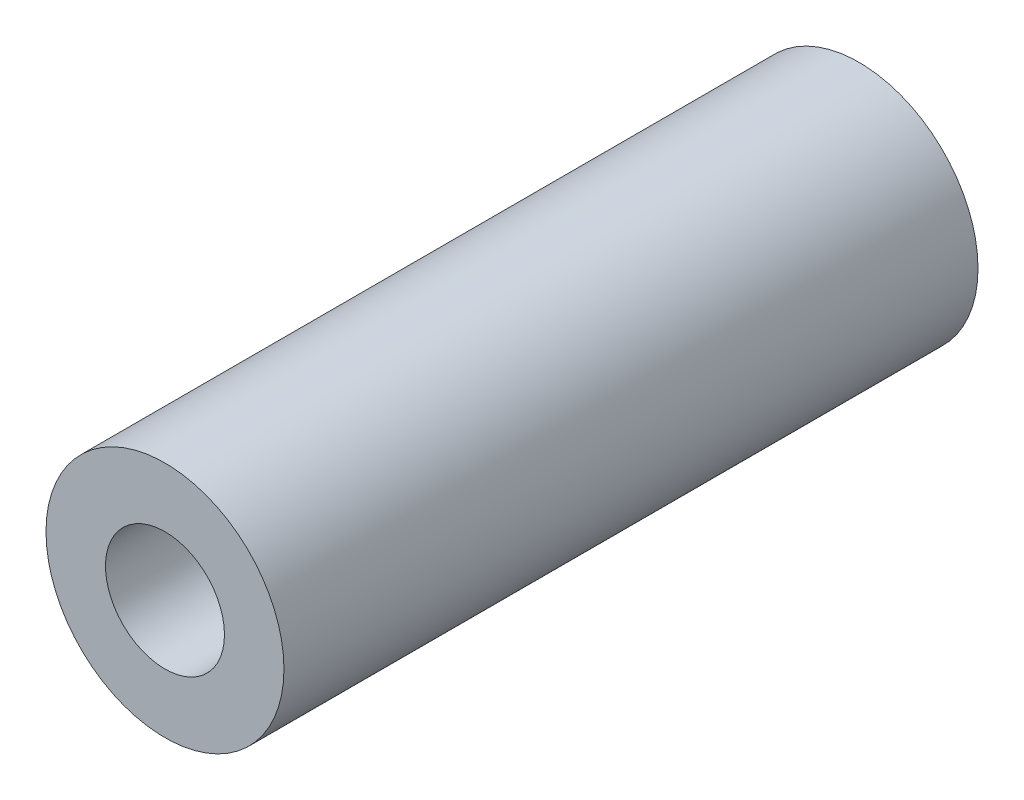
ISO-10303-21;
HEADER;
FILE_DESCRIPTION(('STEP AP214'),'2;1');
FILE_NAME('part.step','',(''),(''),'','','');
FILE_SCHEMA(('AUTOMOTIVE_DESIGN { 1 0 10303 214 1 1 1 1 }'));
ENDSEC;
DATA;
#1=APPLICATION_CONTEXT('core data for automotive mechanical design processes');
#2=APPLICATION_PROTOCOL_DEFINITION('international standard','automotive_design',2000,#1);
#3=PRODUCT_CONTEXT('',#1,'mechanical');
#4=PRODUCT('Part','Part','',(#3));
#5=PRODUCT_RELATED_PRODUCT_CATEGORY('part','',(#4));
#6=PRODUCT_DEFINITION_FORMATION('','',#4);
#7=PRODUCT_DEFINITION_CONTEXT('part definition',#1,'design');
#8=PRODUCT_DEFINITION('design','',#6,#7);
#9=PRODUCT_DEFINITION_SHAPE('','',#8);
#10=(LENGTH_UNIT() NAMED_UNIT(*) SI_UNIT(.MILLI.,.METRE.));
#11=(NAMED_UNIT(*) PLANE_ANGLE_UNIT() SI_UNIT($,.RADIAN.));
#12=(NAMED_UNIT(*) SI_UNIT($,.STERADIAN.) SOLID_ANGLE_UNIT());
#13=UNCERTAINTY_MEASURE_WITH_UNIT(LENGTH_MEASURE(1.E-05),#10,'distance_accuracy_value','');
#14=(GEOMETRIC_REPRESENTATION_CONTEXT(3) GLOBAL_UNCERTAINTY_ASSIGNED_CONTEXT((#13)) GLOBAL_UNIT_ASSIGNED_CONTEXT((#10,
#11,#12)) REPRESENTATION_CONTEXT('',''));
#15=CARTESIAN_POINT('',(0.,0.,0.));
#16=DIRECTION('',(0.,0.,1.));
#17=DIRECTION('',(1.,0.,0.));
#18=AXIS2_PLACEMENT_3D('',#15,#16,#17);
#19=CARTESIAN_POINT('',(0.,0.,35.));
#20=DIRECTION('',(0.,0.,-1.));
#21=DIRECTION('',(-1.,0.,0.));
#22=AXIS2_PLACEMENT_3D('',#19,#20,#21);
#23=CYLINDRICAL_SURFACE('',#22,3.);
#24=CARTESIAN_POINT('',(0.,0.,5.));
#25=DIRECTION('',(0.,0.,1.));
#26=DIRECTION('',(1.,0.,0.));
#27=AXIS2_PLACEMENT_3D('',#24,#25,#26);
#28=CIRCLE('',#27,3.);
#29=CARTESIAN_POINT('',(3.,0.,5.));
#30=VERTEX_POINT('',#29);
#31=EDGE_CURVE('E10',#30,#30,#28,.T.);
#32=ORIENTED_EDGE('',*,*,#31,.F.);
#33=EDGE_LOOP('',(#32));
#34=FACE_BOUND('',#33,.T.);
#35=CARTESIAN_POINT('',(0.,0.,35.));
#36=DIRECTION('',(0.,0.,1.));
#37=DIRECTION('',(1.,0.,0.));
#38=AXIS2_PLACEMENT_3D('',#35,#36,#37);
#39=CIRCLE('',#38,3.);
#40=CARTESIAN_POINT('',(3.,0.,35.));
#41=VERTEX_POINT('',#40);
#42=EDGE_CURVE('E49',#41,#41,#39,.T.);
#43=ORIENTED_EDGE('',*,*,#42,.T.);
#44=EDGE_LOOP('',(#43));
#45=FACE_BOUND('',#44,.T.);
#46=ADVANCED_FACE('F37',(#34,#45),#23,.F.);
#47=CARTESIAN_POINT('',(0.,0.,35.));
#48=DIRECTION('',(0.,0.,-1.));
#49=DIRECTION('',(-1.,0.,0.));
#50=AXIS2_PLACEMENT_3D('',#47,#48,#49);
#51=CYLINDRICAL_SURFACE('',#50,6.);
#52=CARTESIAN_POINT('',(0.,0.,35.));
#53=DIRECTION('',(0.,0.,1.));
#54=DIRECTION('',(1.,0.,0.));
#55=AXIS2_PLACEMENT_3D('',#52,#53,#54);
#56=CIRCLE('',#55,6.);
#57=CARTESIAN_POINT('',(6.,0.,35.));
#58=VERTEX_POINT('',#57);
#59=EDGE_CURVE('E44',#58,#58,#56,.T.);
#60=ORIENTED_EDGE('',*,*,#59,.F.);
#61=EDGE_LOOP('',(#60));
#62=FACE_BOUND('',#61,.T.);
#63=CARTESIAN_POINT('',(0.,0.,0.));
#64=DIRECTION('',(0.,0.,1.));
#65=DIRECTION('',(1.,0.,0.));
#66=AXIS2_PLACEMENT_3D('',#63,#64,#65);
#67=CIRCLE('',#66,6.);
#68=CARTESIAN_POINT('',(6.,0.,0.));
#69=VERTEX_POINT('',#68);
#70=EDGE_CURVE('E55',#69,#69,#67,.T.);
#71=ORIENTED_EDGE('',*,*,#70,.T.);
#72=EDGE_LOOP('',(#71));
#73=FACE_BOUND('',#72,.T.);
#74=ADVANCED_FACE('F90',(#62,#73),#51,.T.);
#75=CARTESIAN_POINT('',(0.,0.,35.));
#76=DIRECTION('',(0.,0.,1.));
#77=DIRECTION('',(1.,0.,0.));
#78=AXIS2_PLACEMENT_3D('',#75,#76,#77);
#79=PLANE('',#78);
#80=ORIENTED_EDGE('',*,*,#42,.F.);
#81=EDGE_LOOP('',(#80));
#82=FACE_BOUND('',#81,.T.);
#83=ORIENTED_EDGE('',*,*,#59,.T.);
#84=EDGE_LOOP('',(#83));
#85=FACE_BOUND('',#84,.T.);
#86=ADVANCED_FACE('F85',(#82,#85),#79,.T.);
#87=CARTESIAN_POINT('',(0.,0.,0.));
#88=DIRECTION('',(0.,0.,1.));
#89=DIRECTION('',(1.,0.,0.));
#90=AXIS2_PLACEMENT_3D('',#87,#88,#89);
#91=PLANE('',#90);
#92=ORIENTED_EDGE('',*,*,#70,.F.);
#93=EDGE_LOOP('',(#92));
#94=FACE_BOUND('',#93,.T.);
#95=CARTESIAN_POINT('',(0.,0.,0.));
#96=DIRECTION('',(0.,0.,1.));
#97=DIRECTION('',(1.,0.,0.));
#98=AXIS2_PLACEMENT_3D('',#95,#96,#97);
#99=CIRCLE('',#98,1.5);
#100=CARTESIAN_POINT('',(1.5,0.,0.));
#101=VERTEX_POINT('',#100);
#102=EDGE_CURVE('E65',#101,#101,#99,.T.);
#103=ORIENTED_EDGE('',*,*,#102,.T.);
#104=EDGE_LOOP('',(#103));
#105=FACE_BOUND('',#104,.T.);
#106=ADVANCED_FACE('F73',(#94,#105),#91,.F.);
#107=CARTESIAN_POINT('',(0.,0.,5.));
#108=DIRECTION('',(0.,0.,-1.));
#109=DIRECTION('',(-1.,0.,0.));
#110=AXIS2_PLACEMENT_3D('',#107,#108,#109);
#111=CYLINDRICAL_SURFACE('',#110,1.5);
#112=CARTESIAN_POINT('',(0.,0.,5.));
#113=DIRECTION('',(0.,0.,1.));
#114=DIRECTION('',(1.,0.,0.));
#115=AXIS2_PLACEMENT_3D('',#112,#113,#114);
#116=CIRCLE('',#115,1.5);
#117=CARTESIAN_POINT('',(1.5,0.,5.));
#118=VERTEX_POINT('',#117);
#119=EDGE_CURVE('E60',#118,#118,#116,.T.);
#120=ORIENTED_EDGE('',*,*,#119,.T.);
#121=EDGE_LOOP('',(#120));
#122=FACE_BOUND('',#121,.T.);
#123=ORIENTED_EDGE('',*,*,#102,.F.);
#124=EDGE_LOOP('',(#123));
#125=FACE_BOUND('',#124,.T.);
#126=ADVANCED_FACE('F75',(#122,#125),#111,.F.);
#127=CARTESIAN_POINT('',(0.,0.,5.));
#128=DIRECTION('',(0.,0.,1.));
#129=DIRECTION('',(1.,0.,0.));
#130=AXIS2_PLACEMENT_3D('',#127,#128,#129);
#131=PLANE('',#130);
#132=ORIENTED_EDGE('',*,*,#119,.F.);
#133=EDGE_LOOP('',(#132));
#134=FACE_BOUND('',#133,.T.);
#135=ORIENTED_EDGE('',*,*,#31,.T.);
#136=EDGE_LOOP('',(#135));
#137=FACE_BOUND('',#136,.T.);
#138=ADVANCED_FACE('F77',(#134,#137),#131,.T.);
#139=CLOSED_SHELL('',(#46,#74,#86,#106,#126,#138));
#140=MANIFOLD_SOLID_BREP('B2',#139);
#141=ADVANCED_BREP_SHAPE_REPRESENTATION('',(#18,#140),#14);
#142=SHAPE_DEFINITION_REPRESENTATION(#9,#141);
ENDSEC;
END-ISO-10303-21;
